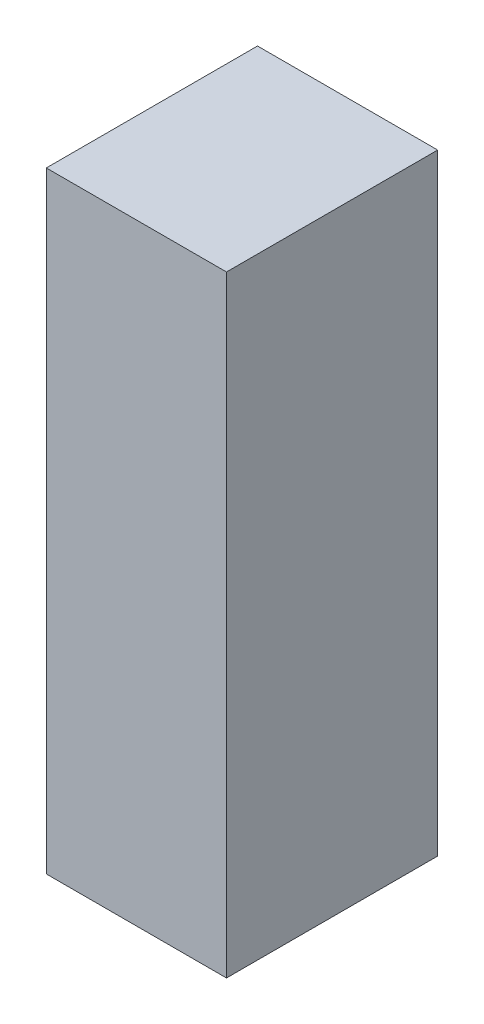
ISO-10303-21;
HEADER;
FILE_DESCRIPTION(('STEP AP214'),'2;1');
FILE_NAME('part.step','',(''),(''),'','','');
FILE_SCHEMA(('AUTOMOTIVE_DESIGN { 1 0 10303 214 1 1 1 1 }'));
ENDSEC;
DATA;
#1=APPLICATION_CONTEXT('core data for automotive mechanical design processes');
#2=APPLICATION_PROTOCOL_DEFINITION('international standard','automotive_design',2000,#1);
#3=PRODUCT_CONTEXT('',#1,'mechanical');
#4=PRODUCT('Part','Part','',(#3));
#5=PRODUCT_RELATED_PRODUCT_CATEGORY('part','',(#4));
#6=PRODUCT_DEFINITION_FORMATION('','',#4);
#7=PRODUCT_DEFINITION_CONTEXT('part definition',#1,'design');
#8=PRODUCT_DEFINITION('design','',#6,#7);
#9=PRODUCT_DEFINITION_SHAPE('','',#8);
#10=(LENGTH_UNIT() NAMED_UNIT(*) SI_UNIT(.MILLI.,.METRE.));
#11=(NAMED_UNIT(*) PLANE_ANGLE_UNIT() SI_UNIT($,.RADIAN.));
#12=(NAMED_UNIT(*) SI_UNIT($,.STERADIAN.) SOLID_ANGLE_UNIT());
#13=UNCERTAINTY_MEASURE_WITH_UNIT(LENGTH_MEASURE(1.E-05),#10,'distance_accuracy_value','');
#14=(GEOMETRIC_REPRESENTATION_CONTEXT(3) GLOBAL_UNCERTAINTY_ASSIGNED_CONTEXT((#13)) GLOBAL_UNIT_ASSIGNED_CONTEXT((#10,
#11,#12)) REPRESENTATION_CONTEXT('',''));
#15=CARTESIAN_POINT('',(0.,0.,0.));
#16=DIRECTION('',(0.,0.,1.));
#17=DIRECTION('',(1.,0.,0.));
#18=AXIS2_PLACEMENT_3D('',#15,#16,#17);
#19=CARTESIAN_POINT('',(0.,1051.56,0.));
#20=DIRECTION('',(1.,0.,0.));
#21=DIRECTION('',(0.,0.,-1.));
#22=AXIS2_PLACEMENT_3D('',#19,#20,#21);
#23=PLANE('',#22);
#24=DIRECTION('',(0.,0.,1.));
#25=VECTOR('',#24,1.);
#26=CARTESIAN_POINT('',(0.,0.,0.));
#27=LINE('',#26,#25);
#28=CARTESIAN_POINT('',(0.,0.,-363.22));
#29=VERTEX_POINT('',#28);
#30=CARTESIAN_POINT('',(0.,0.,0.));
#31=VERTEX_POINT('',#30);
#32=EDGE_CURVE('E103',#29,#31,#27,.T.);
#33=ORIENTED_EDGE('',*,*,#32,.T.);
#34=DIRECTION('',(0.,-1.,0.));
#35=VECTOR('',#34,1.);
#36=CARTESIAN_POINT('',(0.,1051.56,0.));
#37=LINE('',#36,#35);
#38=CARTESIAN_POINT('',(0.,1051.56,0.));
#39=VERTEX_POINT('',#38);
#40=EDGE_CURVE('E11',#39,#31,#37,.T.);
#41=ORIENTED_EDGE('',*,*,#40,.F.);
#42=DIRECTION('',(0.,0.,1.));
#43=VECTOR('',#42,1.);
#44=CARTESIAN_POINT('',(0.,1051.56,0.));
#45=LINE('',#44,#43);
#46=CARTESIAN_POINT('',(0.,1051.56,-363.22));
#47=VERTEX_POINT('',#46);
#48=EDGE_CURVE('E93',#47,#39,#45,.T.);
#49=ORIENTED_EDGE('',*,*,#48,.F.);
#50=DIRECTION('',(0.,-1.,0.));
#51=VECTOR('',#50,1.);
#52=CARTESIAN_POINT('',(0.,1051.56,-363.22));
#53=LINE('',#52,#51);
#54=EDGE_CURVE('E102',#47,#29,#53,.T.);
#55=ORIENTED_EDGE('',*,*,#54,.T.);
#56=EDGE_LOOP('',(#33,#41,#49,#55));
#57=FACE_BOUND('',#56,.T.);
#58=ADVANCED_FACE('F45',(#57),#23,.F.);
#59=CARTESIAN_POINT('',(0.,1051.56,0.));
#60=DIRECTION('',(0.,0.,-1.));
#61=DIRECTION('',(-1.,0.,0.));
#62=AXIS2_PLACEMENT_3D('',#59,#60,#61);
#63=PLANE('',#62);
#64=DIRECTION('',(1.,0.,0.));
#65=VECTOR('',#64,1.);
#66=CARTESIAN_POINT('',(0.,0.,0.));
#67=LINE('',#66,#65);
#68=CARTESIAN_POINT('',(309.88,0.,0.));
#69=VERTEX_POINT('',#68);
#70=EDGE_CURVE('E100',#31,#69,#67,.T.);
#71=ORIENTED_EDGE('',*,*,#70,.T.);
#72=DIRECTION('',(0.,-1.,0.));
#73=VECTOR('',#72,1.);
#74=CARTESIAN_POINT('',(309.88,1051.56,0.));
#75=LINE('',#74,#73);
#76=CARTESIAN_POINT('',(309.88,1051.56,0.));
#77=VERTEX_POINT('',#76);
#78=EDGE_CURVE('E49',#77,#69,#75,.T.);
#79=ORIENTED_EDGE('',*,*,#78,.F.);
#80=DIRECTION('',(1.,0.,0.));
#81=VECTOR('',#80,1.);
#82=CARTESIAN_POINT('',(0.,1051.56,0.));
#83=LINE('',#82,#81);
#84=EDGE_CURVE('E88',#39,#77,#83,.T.);
#85=ORIENTED_EDGE('',*,*,#84,.F.);
#86=ORIENTED_EDGE('',*,*,#40,.T.);
#87=EDGE_LOOP('',(#71,#79,#85,#86));
#88=FACE_BOUND('',#87,.T.);
#89=ADVANCED_FACE('F96',(#88),#63,.F.);
#90=CARTESIAN_POINT('',(309.88,1051.56,0.));
#91=DIRECTION('',(-1.,0.,0.));
#92=DIRECTION('',(0.,0.,1.));
#93=AXIS2_PLACEMENT_3D('',#90,#91,#92);
#94=PLANE('',#93);
#95=DIRECTION('',(0.,0.,-1.));
#96=VECTOR('',#95,1.);
#97=CARTESIAN_POINT('',(309.88,0.,0.));
#98=LINE('',#97,#96);
#99=CARTESIAN_POINT('',(309.88,0.,-363.22));
#100=VERTEX_POINT('',#99);
#101=EDGE_CURVE('E75',#69,#100,#98,.T.);
#102=ORIENTED_EDGE('',*,*,#101,.T.);
#103=DIRECTION('',(0.,-1.,0.));
#104=VECTOR('',#103,1.);
#105=CARTESIAN_POINT('',(309.88,1051.56,-363.22));
#106=LINE('',#105,#104);
#107=CARTESIAN_POINT('',(309.88,1051.56,-363.22));
#108=VERTEX_POINT('',#107);
#109=EDGE_CURVE('E97',#108,#100,#106,.T.);
#110=ORIENTED_EDGE('',*,*,#109,.F.);
#111=DIRECTION('',(0.,0.,-1.));
#112=VECTOR('',#111,1.);
#113=CARTESIAN_POINT('',(309.88,1051.56,0.));
#114=LINE('',#113,#112);
#115=EDGE_CURVE('E91',#77,#108,#114,.T.);
#116=ORIENTED_EDGE('',*,*,#115,.F.);
#117=ORIENTED_EDGE('',*,*,#78,.T.);
#118=EDGE_LOOP('',(#102,#110,#116,#117));
#119=FACE_BOUND('',#118,.T.);
#120=ADVANCED_FACE('F98',(#119),#94,.F.);
#121=CARTESIAN_POINT('',(0.,1051.56,-363.22));
#122=DIRECTION('',(0.,0.,1.));
#123=DIRECTION('',(1.,0.,0.));
#124=AXIS2_PLACEMENT_3D('',#121,#122,#123);
#125=PLANE('',#124);
#126=DIRECTION('',(-1.,0.,0.));
#127=VECTOR('',#126,1.);
#128=CARTESIAN_POINT('',(0.,0.,-363.22));
#129=LINE('',#128,#127);
#130=EDGE_CURVE('E83',#100,#29,#129,.T.);
#131=ORIENTED_EDGE('',*,*,#130,.T.);
#132=ORIENTED_EDGE('',*,*,#54,.F.);
#133=DIRECTION('',(-1.,0.,0.));
#134=VECTOR('',#133,1.);
#135=CARTESIAN_POINT('',(0.,1051.56,-363.22));
#136=LINE('',#135,#134);
#137=EDGE_CURVE('E59',#108,#47,#136,.T.);
#138=ORIENTED_EDGE('',*,*,#137,.F.);
#139=ORIENTED_EDGE('',*,*,#109,.T.);
#140=EDGE_LOOP('',(#131,#132,#138,#139));
#141=FACE_BOUND('',#140,.T.);
#142=ADVANCED_FACE('F115',(#141),#125,.F.);
#143=CARTESIAN_POINT('',(0.,1051.56,0.));
#144=DIRECTION('',(0.,-1.,0.));
#145=DIRECTION('',(0.,0.,-1.));
#146=AXIS2_PLACEMENT_3D('',#143,#144,#145);
#147=PLANE('',#146);
#148=ORIENTED_EDGE('',*,*,#48,.T.);
#149=ORIENTED_EDGE('',*,*,#84,.T.);
#150=ORIENTED_EDGE('',*,*,#115,.T.);
#151=ORIENTED_EDGE('',*,*,#137,.T.);
#152=EDGE_LOOP('',(#148,#149,#150,#151));
#153=FACE_BOUND('',#152,.T.);
#154=ADVANCED_FACE('F87',(#153),#147,.F.);
#155=CARTESIAN_POINT('',(0.,0.,0.));
#156=DIRECTION('',(0.,-1.,0.));
#157=DIRECTION('',(0.,0.,-1.));
#158=AXIS2_PLACEMENT_3D('',#155,#156,#157);
#159=PLANE('',#158);
#160=ORIENTED_EDGE('',*,*,#32,.F.);
#161=ORIENTED_EDGE('',*,*,#130,.F.);
#162=ORIENTED_EDGE('',*,*,#101,.F.);
#163=ORIENTED_EDGE('',*,*,#70,.F.);
#164=EDGE_LOOP('',(#160,#161,#162,#163));
#165=FACE_BOUND('',#164,.T.);
#166=ADVANCED_FACE('F113',(#165),#159,.T.);
#167=CLOSED_SHELL('',(#58,#89,#120,#142,#154,#166));
#168=MANIFOLD_SOLID_BREP('B2',#167);
#169=ADVANCED_BREP_SHAPE_REPRESENTATION('',(#18,#168),#14);
#170=SHAPE_DEFINITION_REPRESENTATION(#9,#169);
ENDSEC;
END-ISO-10303-21;
